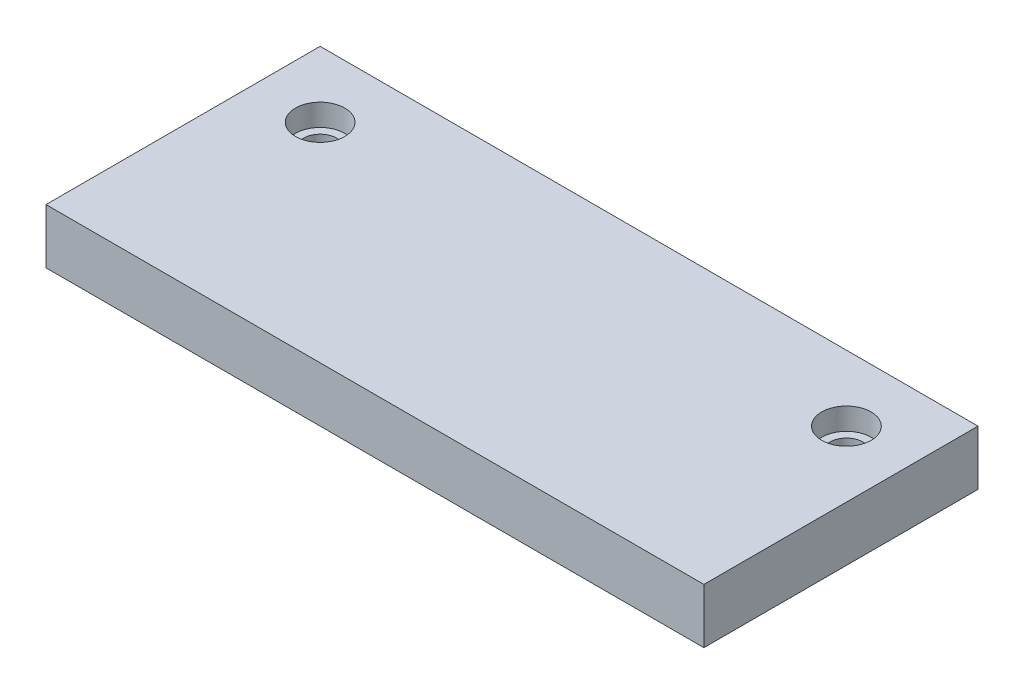
ISO-10303-21;
HEADER;
FILE_DESCRIPTION(('STEP AP214'),'2;1');
FILE_NAME('part.step','',(''),(''),'','','');
FILE_SCHEMA(('AUTOMOTIVE_DESIGN { 1 0 10303 214 1 1 1 1 }'));
ENDSEC;
DATA;
#1=APPLICATION_CONTEXT('core data for automotive mechanical design processes');
#2=APPLICATION_PROTOCOL_DEFINITION('international standard','automotive_design',2000,#1);
#3=PRODUCT_CONTEXT('',#1,'mechanical');
#4=PRODUCT('Part','Part','',(#3));
#5=PRODUCT_RELATED_PRODUCT_CATEGORY('part','',(#4));
#6=PRODUCT_DEFINITION_FORMATION('','',#4);
#7=PRODUCT_DEFINITION_CONTEXT('part definition',#1,'design');
#8=PRODUCT_DEFINITION('design','',#6,#7);
#9=PRODUCT_DEFINITION_SHAPE('','',#8);
#10=(LENGTH_UNIT() NAMED_UNIT(*) SI_UNIT(.MILLI.,.METRE.));
#11=(NAMED_UNIT(*) PLANE_ANGLE_UNIT() SI_UNIT($,.RADIAN.));
#12=(NAMED_UNIT(*) SI_UNIT($,.STERADIAN.) SOLID_ANGLE_UNIT());
#13=UNCERTAINTY_MEASURE_WITH_UNIT(LENGTH_MEASURE(1.E-05),#10,'distance_accuracy_value','');
#14=(GEOMETRIC_REPRESENTATION_CONTEXT(3) GLOBAL_UNCERTAINTY_ASSIGNED_CONTEXT((#13)) GLOBAL_UNIT_ASSIGNED_CONTEXT((#10,
#11,#12)) REPRESENTATION_CONTEXT('',''));
#15=CARTESIAN_POINT('',(0.,0.,0.));
#16=DIRECTION('',(0.,0.,1.));
#17=DIRECTION('',(1.,0.,0.));
#18=AXIS2_PLACEMENT_3D('',#15,#16,#17);
#19=CARTESIAN_POINT('',(6.,5.,-19.));
#20=DIRECTION('',(0.,-1.,0.));
#21=DIRECTION('',(0.,0.,-1.));
#22=AXIS2_PLACEMENT_3D('',#19,#20,#21);
#23=CYLINDRICAL_SURFACE('',#22,1.5);
#24=CARTESIAN_POINT('',(6.,0.,-19.));
#25=DIRECTION('',(0.,1.,0.));
#26=DIRECTION('',(0.,0.,1.));
#27=AXIS2_PLACEMENT_3D('',#24,#25,#26);
#28=CIRCLE('',#27,1.5);
#29=CARTESIAN_POINT('',(6.,0.,-17.5));
#30=VERTEX_POINT('',#29);
#31=EDGE_CURVE('E132',#30,#30,#28,.T.);
#32=ORIENTED_EDGE('',*,*,#31,.F.);
#33=EDGE_LOOP('',(#32));
#34=FACE_BOUND('',#33,.T.);
#35=CARTESIAN_POINT('',(6.,3.,-19.));
#36=DIRECTION('',(0.,1.,0.));
#37=DIRECTION('',(0.,0.,1.));
#38=AXIS2_PLACEMENT_3D('',#35,#36,#37);
#39=CIRCLE('',#38,1.5);
#40=CARTESIAN_POINT('',(6.,3.,-17.5));
#41=VERTEX_POINT('',#40);
#42=EDGE_CURVE('E67',#41,#41,#39,.T.);
#43=ORIENTED_EDGE('',*,*,#42,.T.);
#44=EDGE_LOOP('',(#43));
#45=FACE_BOUND('',#44,.T.);
#46=ADVANCED_FACE('F63',(#34,#45),#23,.F.);
#47=CARTESIAN_POINT('',(54.,5.,-19.));
#48=DIRECTION('',(0.,-1.,0.));
#49=DIRECTION('',(0.,0.,-1.));
#50=AXIS2_PLACEMENT_3D('',#47,#48,#49);
#51=CYLINDRICAL_SURFACE('',#50,1.5);
#52=CARTESIAN_POINT('',(54.,0.,-19.));
#53=DIRECTION('',(0.,1.,0.));
#54=DIRECTION('',(0.,0.,1.));
#55=AXIS2_PLACEMENT_3D('',#52,#53,#54);
#56=CIRCLE('',#55,1.5);
#57=CARTESIAN_POINT('',(54.,0.,-17.5));
#58=VERTEX_POINT('',#57);
#59=EDGE_CURVE('E146',#58,#58,#56,.T.);
#60=ORIENTED_EDGE('',*,*,#59,.F.);
#61=EDGE_LOOP('',(#60));
#62=FACE_BOUND('',#61,.T.);
#63=CARTESIAN_POINT('',(54.,3.,-19.));
#64=DIRECTION('',(0.,1.,0.));
#65=DIRECTION('',(0.,0.,1.));
#66=AXIS2_PLACEMENT_3D('',#63,#64,#65);
#67=CIRCLE('',#66,1.5);
#68=CARTESIAN_POINT('',(54.,3.,-17.5));
#69=VERTEX_POINT('',#68);
#70=EDGE_CURVE('E140',#69,#69,#67,.T.);
#71=ORIENTED_EDGE('',*,*,#70,.T.);
#72=EDGE_LOOP('',(#71));
#73=FACE_BOUND('',#72,.T.);
#74=ADVANCED_FACE('F171',(#62,#73),#51,.F.);
#75=CARTESIAN_POINT('',(0.,5.,0.));
#76=DIRECTION('',(0.,1.,0.));
#77=DIRECTION('',(0.,0.,1.));
#78=AXIS2_PLACEMENT_3D('',#75,#76,#77);
#79=PLANE('',#78);
#80=CARTESIAN_POINT('',(6.,5.,-19.));
#81=DIRECTION('',(0.,1.,0.));
#82=DIRECTION('',(0.,0.,1.));
#83=AXIS2_PLACEMENT_3D('',#80,#81,#82);
#84=CIRCLE('',#83,2.25);
#85=CARTESIAN_POINT('',(6.,5.,-16.75));
#86=VERTEX_POINT('',#85);
#87=EDGE_CURVE('E148',#86,#86,#84,.T.);
#88=ORIENTED_EDGE('',*,*,#87,.F.);
#89=EDGE_LOOP('',(#88));
#90=FACE_BOUND('',#89,.T.);
#91=CARTESIAN_POINT('',(54.,5.,-19.));
#92=DIRECTION('',(0.,1.,0.));
#93=DIRECTION('',(0.,0.,1.));
#94=AXIS2_PLACEMENT_3D('',#91,#92,#93);
#95=CIRCLE('',#94,2.25);
#96=CARTESIAN_POINT('',(54.,5.,-16.75));
#97=VERTEX_POINT('',#96);
#98=EDGE_CURVE('E158',#97,#97,#95,.T.);
#99=ORIENTED_EDGE('',*,*,#98,.F.);
#100=EDGE_LOOP('',(#99));
#101=FACE_BOUND('',#100,.T.);
#102=DIRECTION('',(1.,0.,0.));
#103=VECTOR('',#102,1.);
#104=CARTESIAN_POINT('',(0.,5.,0.));
#105=LINE('',#104,#103);
#106=CARTESIAN_POINT('',(0.,5.,0.));
#107=VERTEX_POINT('',#106);
#108=CARTESIAN_POINT('',(60.,5.,0.));
#109=VERTEX_POINT('',#108);
#110=EDGE_CURVE('E115',#107,#109,#105,.T.);
#111=ORIENTED_EDGE('',*,*,#110,.T.);
#112=DIRECTION('',(0.,0.,-1.));
#113=VECTOR('',#112,1.);
#114=CARTESIAN_POINT('',(60.,5.,0.));
#115=LINE('',#114,#113);
#116=CARTESIAN_POINT('',(60.,5.,-25.));
#117=VERTEX_POINT('',#116);
#118=EDGE_CURVE('E107',#109,#117,#115,.T.);
#119=ORIENTED_EDGE('',*,*,#118,.T.);
#120=DIRECTION('',(1.,0.,0.));
#121=VECTOR('',#120,1.);
#122=CARTESIAN_POINT('',(0.,5.,-25.));
#123=LINE('',#122,#121);
#124=CARTESIAN_POINT('',(0.,5.,-25.));
#125=VERTEX_POINT('',#124);
#126=EDGE_CURVE('E114',#125,#117,#123,.T.);
#127=ORIENTED_EDGE('',*,*,#126,.F.);
#128=DIRECTION('',(0.,0.,-1.));
#129=VECTOR('',#128,1.);
#130=CARTESIAN_POINT('',(0.,5.,0.));
#131=LINE('',#130,#129);
#132=EDGE_CURVE('E125',#107,#125,#131,.T.);
#133=ORIENTED_EDGE('',*,*,#132,.F.);
#134=EDGE_LOOP('',(#111,#119,#127,#133));
#135=FACE_BOUND('',#134,.T.);
#136=ADVANCED_FACE('F111',(#90,#101,#135),#79,.T.);
#137=CARTESIAN_POINT('',(0.,0.,0.));
#138=DIRECTION('',(0.,1.,0.));
#139=DIRECTION('',(0.,0.,1.));
#140=AXIS2_PLACEMENT_3D('',#137,#138,#139);
#141=PLANE('',#140);
#142=DIRECTION('',(1.,0.,0.));
#143=VECTOR('',#142,1.);
#144=CARTESIAN_POINT('',(0.,0.,0.));
#145=LINE('',#144,#143);
#146=CARTESIAN_POINT('',(0.,0.,0.));
#147=VERTEX_POINT('',#146);
#148=CARTESIAN_POINT('',(60.,0.,0.));
#149=VERTEX_POINT('',#148);
#150=EDGE_CURVE('E130',#147,#149,#145,.T.);
#151=ORIENTED_EDGE('',*,*,#150,.F.);
#152=DIRECTION('',(0.,0.,-1.));
#153=VECTOR('',#152,1.);
#154=CARTESIAN_POINT('',(0.,0.,0.));
#155=LINE('',#154,#153);
#156=CARTESIAN_POINT('',(0.,0.,-25.));
#157=VERTEX_POINT('',#156);
#158=EDGE_CURVE('E136',#147,#157,#155,.T.);
#159=ORIENTED_EDGE('',*,*,#158,.T.);
#160=DIRECTION('',(1.,0.,0.));
#161=VECTOR('',#160,1.);
#162=CARTESIAN_POINT('',(0.,0.,-25.));
#163=LINE('',#162,#161);
#164=CARTESIAN_POINT('',(60.,0.,-25.));
#165=VERTEX_POINT('',#164);
#166=EDGE_CURVE('E134',#157,#165,#163,.T.);
#167=ORIENTED_EDGE('',*,*,#166,.T.);
#168=DIRECTION('',(0.,0.,-1.));
#169=VECTOR('',#168,1.);
#170=CARTESIAN_POINT('',(60.,0.,0.));
#171=LINE('',#170,#169);
#172=EDGE_CURVE('E120',#149,#165,#171,.T.);
#173=ORIENTED_EDGE('',*,*,#172,.F.);
#174=EDGE_LOOP('',(#151,#159,#167,#173));
#175=FACE_BOUND('',#174,.T.);
#176=ORIENTED_EDGE('',*,*,#31,.T.);
#177=EDGE_LOOP('',(#176));
#178=FACE_BOUND('',#177,.T.);
#179=ORIENTED_EDGE('',*,*,#59,.T.);
#180=EDGE_LOOP('',(#179));
#181=FACE_BOUND('',#180,.T.);
#182=ADVANCED_FACE('F166',(#175,#178,#181),#141,.F.);
#183=CARTESIAN_POINT('',(0.,5.,0.));
#184=DIRECTION('',(0.,0.,-1.));
#185=DIRECTION('',(-1.,0.,0.));
#186=AXIS2_PLACEMENT_3D('',#183,#184,#185);
#187=PLANE('',#186);
#188=ORIENTED_EDGE('',*,*,#150,.T.);
#189=DIRECTION('',(0.,-1.,0.));
#190=VECTOR('',#189,1.);
#191=CARTESIAN_POINT('',(60.,5.,0.));
#192=LINE('',#191,#190);
#193=EDGE_CURVE('E12',#109,#149,#192,.T.);
#194=ORIENTED_EDGE('',*,*,#193,.F.);
#195=ORIENTED_EDGE('',*,*,#110,.F.);
#196=DIRECTION('',(0.,-1.,0.));
#197=VECTOR('',#196,1.);
#198=CARTESIAN_POINT('',(0.,5.,0.));
#199=LINE('',#198,#197);
#200=EDGE_CURVE('E82',#107,#147,#199,.T.);
#201=ORIENTED_EDGE('',*,*,#200,.T.);
#202=EDGE_LOOP('',(#188,#194,#195,#201));
#203=FACE_BOUND('',#202,.T.);
#204=ADVANCED_FACE('F65',(#203),#187,.F.);
#205=CARTESIAN_POINT('',(60.,5.,0.));
#206=DIRECTION('',(-1.,0.,0.));
#207=DIRECTION('',(0.,0.,1.));
#208=AXIS2_PLACEMENT_3D('',#205,#206,#207);
#209=PLANE('',#208);
#210=ORIENTED_EDGE('',*,*,#172,.T.);
#211=DIRECTION('',(0.,-1.,0.));
#212=VECTOR('',#211,1.);
#213=CARTESIAN_POINT('',(60.,5.,-25.));
#214=LINE('',#213,#212);
#215=EDGE_CURVE('E73',#117,#165,#214,.T.);
#216=ORIENTED_EDGE('',*,*,#215,.F.);
#217=ORIENTED_EDGE('',*,*,#118,.F.);
#218=ORIENTED_EDGE('',*,*,#193,.T.);
#219=EDGE_LOOP('',(#210,#216,#217,#218));
#220=FACE_BOUND('',#219,.T.);
#221=ADVANCED_FACE('F119',(#220),#209,.F.);
#222=CARTESIAN_POINT('',(0.,5.,-25.));
#223=DIRECTION('',(0.,0.,-1.));
#224=DIRECTION('',(-1.,0.,0.));
#225=AXIS2_PLACEMENT_3D('',#222,#223,#224);
#226=PLANE('',#225);
#227=ORIENTED_EDGE('',*,*,#166,.F.);
#228=DIRECTION('',(0.,-1.,0.));
#229=VECTOR('',#228,1.);
#230=CARTESIAN_POINT('',(0.,5.,-25.));
#231=LINE('',#230,#229);
#232=EDGE_CURVE('E96',#125,#157,#231,.T.);
#233=ORIENTED_EDGE('',*,*,#232,.F.);
#234=ORIENTED_EDGE('',*,*,#126,.T.);
#235=ORIENTED_EDGE('',*,*,#215,.T.);
#236=EDGE_LOOP('',(#227,#233,#234,#235));
#237=FACE_BOUND('',#236,.T.);
#238=ADVANCED_FACE('F124',(#237),#226,.T.);
#239=CARTESIAN_POINT('',(0.,5.,0.));
#240=DIRECTION('',(-1.,0.,0.));
#241=DIRECTION('',(0.,0.,1.));
#242=AXIS2_PLACEMENT_3D('',#239,#240,#241);
#243=PLANE('',#242);
#244=ORIENTED_EDGE('',*,*,#158,.F.);
#245=ORIENTED_EDGE('',*,*,#200,.F.);
#246=ORIENTED_EDGE('',*,*,#132,.T.);
#247=ORIENTED_EDGE('',*,*,#232,.T.);
#248=EDGE_LOOP('',(#244,#245,#246,#247));
#249=FACE_BOUND('',#248,.T.);
#250=ADVANCED_FACE('F192',(#249),#243,.T.);
#251=CARTESIAN_POINT('',(54.,3.,-19.));
#252=DIRECTION('',(0.,1.,0.));
#253=DIRECTION('',(0.,0.,1.));
#254=AXIS2_PLACEMENT_3D('',#251,#252,#253);
#255=CYLINDRICAL_SURFACE('',#254,2.25);
#256=CARTESIAN_POINT('',(54.,3.,-19.));
#257=DIRECTION('',(0.,1.,0.));
#258=DIRECTION('',(0.,0.,1.));
#259=AXIS2_PLACEMENT_3D('',#256,#257,#258);
#260=CIRCLE('',#259,2.25);
#261=CARTESIAN_POINT('',(54.,3.,-16.75));
#262=VERTEX_POINT('',#261);
#263=EDGE_CURVE('E153',#262,#262,#260,.T.);
#264=ORIENTED_EDGE('',*,*,#263,.F.);
#265=EDGE_LOOP('',(#264));
#266=FACE_BOUND('',#265,.T.);
#267=ORIENTED_EDGE('',*,*,#98,.T.);
#268=EDGE_LOOP('',(#267));
#269=FACE_BOUND('',#268,.T.);
#270=ADVANCED_FACE('F188',(#266,#269),#255,.F.);
#271=CARTESIAN_POINT('',(54.,3.,-19.));
#272=DIRECTION('',(0.,1.,0.));
#273=DIRECTION('',(0.,0.,1.));
#274=AXIS2_PLACEMENT_3D('',#271,#272,#273);
#275=PLANE('',#274);
#276=ORIENTED_EDGE('',*,*,#70,.F.);
#277=EDGE_LOOP('',(#276));
#278=FACE_BOUND('',#277,.T.);
#279=ORIENTED_EDGE('',*,*,#263,.T.);
#280=EDGE_LOOP('',(#279));
#281=FACE_BOUND('',#280,.T.);
#282=ADVANCED_FACE('F182',(#278,#281),#275,.T.);
#283=CARTESIAN_POINT('',(6.,3.,-19.));
#284=DIRECTION('',(0.,1.,0.));
#285=DIRECTION('',(0.,0.,1.));
#286=AXIS2_PLACEMENT_3D('',#283,#284,#285);
#287=CYLINDRICAL_SURFACE('',#286,2.25);
#288=CARTESIAN_POINT('',(6.,3.,-19.));
#289=DIRECTION('',(0.,1.,0.));
#290=DIRECTION('',(0.,0.,1.));
#291=AXIS2_PLACEMENT_3D('',#288,#289,#290);
#292=CIRCLE('',#291,2.25);
#293=CARTESIAN_POINT('',(6.,3.,-16.75));
#294=VERTEX_POINT('',#293);
#295=EDGE_CURVE('E142',#294,#294,#292,.T.);
#296=ORIENTED_EDGE('',*,*,#295,.F.);
#297=EDGE_LOOP('',(#296));
#298=FACE_BOUND('',#297,.T.);
#299=ORIENTED_EDGE('',*,*,#87,.T.);
#300=EDGE_LOOP('',(#299));
#301=FACE_BOUND('',#300,.T.);
#302=ADVANCED_FACE('F177',(#298,#301),#287,.F.);
#303=CARTESIAN_POINT('',(6.,3.,-19.));
#304=DIRECTION('',(0.,1.,0.));
#305=DIRECTION('',(0.,0.,1.));
#306=AXIS2_PLACEMENT_3D('',#303,#304,#305);
#307=PLANE('',#306);
#308=ORIENTED_EDGE('',*,*,#42,.F.);
#309=EDGE_LOOP('',(#308));
#310=FACE_BOUND('',#309,.T.);
#311=ORIENTED_EDGE('',*,*,#295,.T.);
#312=EDGE_LOOP('',(#311));
#313=FACE_BOUND('',#312,.T.);
#314=ADVANCED_FACE('F175',(#310,#313),#307,.T.);
#315=CLOSED_SHELL('',(#46,#74,#136,#182,#204,#221,#238,#250,#270,#282,#302,#314));
#316=MANIFOLD_SOLID_BREP('B2',#315);
#317=ADVANCED_BREP_SHAPE_REPRESENTATION('',(#18,#316),#14);
#318=SHAPE_DEFINITION_REPRESENTATION(#9,#317);
ENDSEC;
END-ISO-10303-21;
